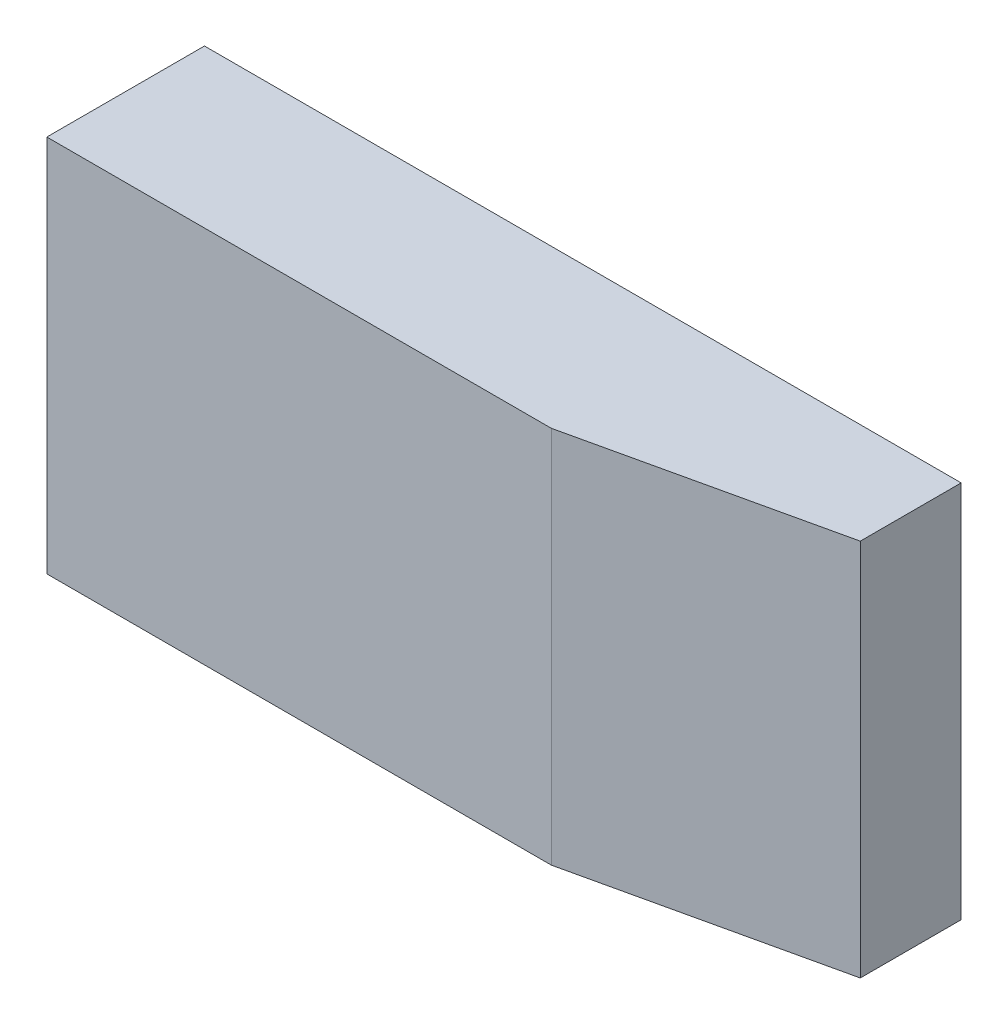
ISO-10303-21;
HEADER;
FILE_DESCRIPTION(('STEP AP214'),'2;1');
FILE_NAME('part.step','',(''),(''),'','','');
FILE_SCHEMA(('AUTOMOTIVE_DESIGN { 1 0 10303 214 1 1 1 1 }'));
ENDSEC;
DATA;
#1=APPLICATION_CONTEXT('core data for automotive mechanical design processes');
#2=APPLICATION_PROTOCOL_DEFINITION('international standard','automotive_design',2000,#1);
#3=PRODUCT_CONTEXT('',#1,'mechanical');
#4=PRODUCT('Part','Part','',(#3));
#5=PRODUCT_RELATED_PRODUCT_CATEGORY('part','',(#4));
#6=PRODUCT_DEFINITION_FORMATION('','',#4);
#7=PRODUCT_DEFINITION_CONTEXT('part definition',#1,'design');
#8=PRODUCT_DEFINITION('design','',#6,#7);
#9=PRODUCT_DEFINITION_SHAPE('','',#8);
#10=(LENGTH_UNIT() NAMED_UNIT(*) SI_UNIT(.MILLI.,.METRE.));
#11=(NAMED_UNIT(*) PLANE_ANGLE_UNIT() SI_UNIT($,.RADIAN.));
#12=(NAMED_UNIT(*) SI_UNIT($,.STERADIAN.) SOLID_ANGLE_UNIT());
#13=UNCERTAINTY_MEASURE_WITH_UNIT(LENGTH_MEASURE(1.E-05),#10,'distance_accuracy_value','');
#14=(GEOMETRIC_REPRESENTATION_CONTEXT(3) GLOBAL_UNCERTAINTY_ASSIGNED_CONTEXT((#13)) GLOBAL_UNIT_ASSIGNED_CONTEXT((#10,
#11,#12)) REPRESENTATION_CONTEXT('',''));
#15=CARTESIAN_POINT('',(0.,0.,0.));
#16=DIRECTION('',(0.,0.,1.));
#17=DIRECTION('',(1.,0.,0.));
#18=AXIS2_PLACEMENT_3D('',#15,#16,#17);
#19=CARTESIAN_POINT('',(-60.,30.,0.));
#20=DIRECTION('',(0.,0.,1.));
#21=DIRECTION('',(1.,0.,0.));
#22=AXIS2_PLACEMENT_3D('',#19,#20,#21);
#23=PLANE('',#22);
#24=DIRECTION('',(-1.,0.,0.));
#25=VECTOR('',#24,1.);
#26=CARTESIAN_POINT('',(-60.,0.,0.));
#27=LINE('',#26,#25);
#28=CARTESIAN_POINT('',(0.,0.,0.));
#29=VERTEX_POINT('',#28);
#30=CARTESIAN_POINT('',(-60.,0.,0.));
#31=VERTEX_POINT('',#30);
#32=EDGE_CURVE('E124',#29,#31,#27,.T.);
#33=ORIENTED_EDGE('',*,*,#32,.T.);
#34=DIRECTION('',(0.,-1.,0.));
#35=VECTOR('',#34,1.);
#36=CARTESIAN_POINT('',(-60.,30.,0.));
#37=LINE('',#36,#35);
#38=CARTESIAN_POINT('',(-60.,30.,0.));
#39=VERTEX_POINT('',#38);
#40=EDGE_CURVE('E11',#39,#31,#37,.T.);
#41=ORIENTED_EDGE('',*,*,#40,.F.);
#42=DIRECTION('',(-1.,0.,0.));
#43=VECTOR('',#42,1.);
#44=CARTESIAN_POINT('',(-60.,30.,0.));
#45=LINE('',#44,#43);
#46=CARTESIAN_POINT('',(0.,30.,0.));
#47=VERTEX_POINT('',#46);
#48=EDGE_CURVE('E137',#47,#39,#45,.T.);
#49=ORIENTED_EDGE('',*,*,#48,.F.);
#50=DIRECTION('',(0.,-1.,0.));
#51=VECTOR('',#50,1.);
#52=CARTESIAN_POINT('',(0.,30.,0.));
#53=LINE('',#52,#51);
#54=EDGE_CURVE('E120',#47,#29,#53,.T.);
#55=ORIENTED_EDGE('',*,*,#54,.T.);
#56=EDGE_LOOP('',(#33,#41,#49,#55));
#57=FACE_BOUND('',#56,.T.);
#58=ADVANCED_FACE('F45',(#57),#23,.F.);
#59=CARTESIAN_POINT('',(-60.,30.,12.5));
#60=DIRECTION('',(1.,0.,0.));
#61=DIRECTION('',(0.,0.,-1.));
#62=AXIS2_PLACEMENT_3D('',#59,#60,#61);
#63=PLANE('',#62);
#64=DIRECTION('',(0.,0.,1.));
#65=VECTOR('',#64,1.);
#66=CARTESIAN_POINT('',(-60.,0.,12.5));
#67=LINE('',#66,#65);
#68=CARTESIAN_POINT('',(-60.,0.,12.5));
#69=VERTEX_POINT('',#68);
#70=EDGE_CURVE('E128',#31,#69,#67,.T.);
#71=ORIENTED_EDGE('',*,*,#70,.T.);
#72=DIRECTION('',(0.,-1.,0.));
#73=VECTOR('',#72,1.);
#74=CARTESIAN_POINT('',(-60.,30.,12.5));
#75=LINE('',#74,#73);
#76=CARTESIAN_POINT('',(-60.,30.,12.5));
#77=VERTEX_POINT('',#76);
#78=EDGE_CURVE('E54',#77,#69,#75,.T.);
#79=ORIENTED_EDGE('',*,*,#78,.F.);
#80=DIRECTION('',(0.,0.,1.));
#81=VECTOR('',#80,1.);
#82=CARTESIAN_POINT('',(-60.,30.,12.5));
#83=LINE('',#82,#81);
#84=EDGE_CURVE('E96',#39,#77,#83,.T.);
#85=ORIENTED_EDGE('',*,*,#84,.F.);
#86=ORIENTED_EDGE('',*,*,#40,.T.);
#87=EDGE_LOOP('',(#71,#79,#85,#86));
#88=FACE_BOUND('',#87,.T.);
#89=ADVANCED_FACE('F159',(#88),#63,.F.);
#90=CARTESIAN_POINT('',(-20.,30.,12.5));
#91=DIRECTION('',(0.,0.,-1.));
#92=DIRECTION('',(-1.,0.,0.));
#93=AXIS2_PLACEMENT_3D('',#90,#91,#92);
#94=PLANE('',#93);
#95=DIRECTION('',(1.,0.,0.));
#96=VECTOR('',#95,1.);
#97=CARTESIAN_POINT('',(-20.,0.,12.5));
#98=LINE('',#97,#96);
#99=CARTESIAN_POINT('',(-20.,0.,12.5));
#100=VERTEX_POINT('',#99);
#101=EDGE_CURVE('E112',#69,#100,#98,.T.);
#102=ORIENTED_EDGE('',*,*,#101,.T.);
#103=DIRECTION('',(0.,-1.,0.));
#104=VECTOR('',#103,1.);
#105=CARTESIAN_POINT('',(-20.,30.,12.5));
#106=LINE('',#105,#104);
#107=CARTESIAN_POINT('',(-20.,30.,12.5));
#108=VERTEX_POINT('',#107);
#109=EDGE_CURVE('E109',#108,#100,#106,.T.);
#110=ORIENTED_EDGE('',*,*,#109,.F.);
#111=DIRECTION('',(1.,0.,0.));
#112=VECTOR('',#111,1.);
#113=CARTESIAN_POINT('',(-20.,30.,12.5));
#114=LINE('',#113,#112);
#115=EDGE_CURVE('E100',#77,#108,#114,.T.);
#116=ORIENTED_EDGE('',*,*,#115,.F.);
#117=ORIENTED_EDGE('',*,*,#78,.T.);
#118=EDGE_LOOP('',(#102,#110,#116,#117));
#119=FACE_BOUND('',#118,.T.);
#120=ADVANCED_FACE('F110',(#119),#94,.F.);
#121=CARTESIAN_POINT('',(0.,30.,8.));
#122=DIRECTION('',(-0.219512195121951,0.,-0.975609756097561));
#123=DIRECTION('',(-0.975609756097561,0.,0.219512195121951));
#124=AXIS2_PLACEMENT_3D('',#121,#122,#123);
#125=PLANE('',#124);
#126=DIRECTION('',(0.975609756097561,0.,-0.219512195121951));
#127=VECTOR('',#126,1.);
#128=CARTESIAN_POINT('',(0.,0.,8.));
#129=LINE('',#128,#127);
#130=CARTESIAN_POINT('',(0.,0.,8.));
#131=VERTEX_POINT('',#130);
#132=EDGE_CURVE('E82',#100,#131,#129,.T.);
#133=ORIENTED_EDGE('',*,*,#132,.T.);
#134=DIRECTION('',(0.,-1.,0.));
#135=VECTOR('',#134,1.);
#136=CARTESIAN_POINT('',(0.,30.,8.));
#137=LINE('',#136,#135);
#138=CARTESIAN_POINT('',(0.,30.,8.));
#139=VERTEX_POINT('',#138);
#140=EDGE_CURVE('E114',#139,#131,#137,.T.);
#141=ORIENTED_EDGE('',*,*,#140,.F.);
#142=DIRECTION('',(0.975609756097561,0.,-0.219512195121951));
#143=VECTOR('',#142,1.);
#144=CARTESIAN_POINT('',(0.,30.,8.));
#145=LINE('',#144,#143);
#146=EDGE_CURVE('E104',#108,#139,#145,.T.);
#147=ORIENTED_EDGE('',*,*,#146,.F.);
#148=ORIENTED_EDGE('',*,*,#109,.T.);
#149=EDGE_LOOP('',(#133,#141,#147,#148));
#150=FACE_BOUND('',#149,.T.);
#151=ADVANCED_FACE('F116',(#150),#125,.F.);
#152=CARTESIAN_POINT('',(0.,30.,0.));
#153=DIRECTION('',(-1.,0.,0.));
#154=DIRECTION('',(0.,0.,1.));
#155=AXIS2_PLACEMENT_3D('',#152,#153,#154);
#156=PLANE('',#155);
#157=DIRECTION('',(0.,0.,-1.));
#158=VECTOR('',#157,1.);
#159=CARTESIAN_POINT('',(0.,0.,0.));
#160=LINE('',#159,#158);
#161=EDGE_CURVE('E88',#131,#29,#160,.T.);
#162=ORIENTED_EDGE('',*,*,#161,.T.);
#163=ORIENTED_EDGE('',*,*,#54,.F.);
#164=DIRECTION('',(0.,0.,-1.));
#165=VECTOR('',#164,1.);
#166=CARTESIAN_POINT('',(0.,30.,0.));
#167=LINE('',#166,#165);
#168=EDGE_CURVE('E62',#139,#47,#167,.T.);
#169=ORIENTED_EDGE('',*,*,#168,.F.);
#170=ORIENTED_EDGE('',*,*,#140,.T.);
#171=EDGE_LOOP('',(#162,#163,#169,#170));
#172=FACE_BOUND('',#171,.T.);
#173=ADVANCED_FACE('F148',(#172),#156,.F.);
#174=CARTESIAN_POINT('',(0.,30.,0.));
#175=DIRECTION('',(0.,-1.,0.));
#176=DIRECTION('',(0.,0.,-1.));
#177=AXIS2_PLACEMENT_3D('',#174,#175,#176);
#178=PLANE('',#177);
#179=ORIENTED_EDGE('',*,*,#48,.T.);
#180=ORIENTED_EDGE('',*,*,#84,.T.);
#181=ORIENTED_EDGE('',*,*,#115,.T.);
#182=ORIENTED_EDGE('',*,*,#146,.T.);
#183=ORIENTED_EDGE('',*,*,#168,.T.);
#184=EDGE_LOOP('',(#179,#180,#181,#182,#183));
#185=FACE_BOUND('',#184,.T.);
#186=ADVANCED_FACE('F102',(#185),#178,.F.);
#187=CARTESIAN_POINT('',(0.,0.,0.));
#188=DIRECTION('',(0.,-1.,0.));
#189=DIRECTION('',(0.,0.,-1.));
#190=AXIS2_PLACEMENT_3D('',#187,#188,#189);
#191=PLANE('',#190);
#192=ORIENTED_EDGE('',*,*,#32,.F.);
#193=ORIENTED_EDGE('',*,*,#161,.F.);
#194=ORIENTED_EDGE('',*,*,#132,.F.);
#195=ORIENTED_EDGE('',*,*,#101,.F.);
#196=ORIENTED_EDGE('',*,*,#70,.F.);
#197=EDGE_LOOP('',(#192,#193,#194,#195,#196));
#198=FACE_BOUND('',#197,.T.);
#199=ADVANCED_FACE('F144',(#198),#191,.T.);
#200=CLOSED_SHELL('',(#58,#89,#120,#151,#173,#186,#199));
#201=MANIFOLD_SOLID_BREP('B2',#200);
#202=ADVANCED_BREP_SHAPE_REPRESENTATION('',(#18,#201),#14);
#203=SHAPE_DEFINITION_REPRESENTATION(#9,#202);
ENDSEC;
END-ISO-10303-21;
